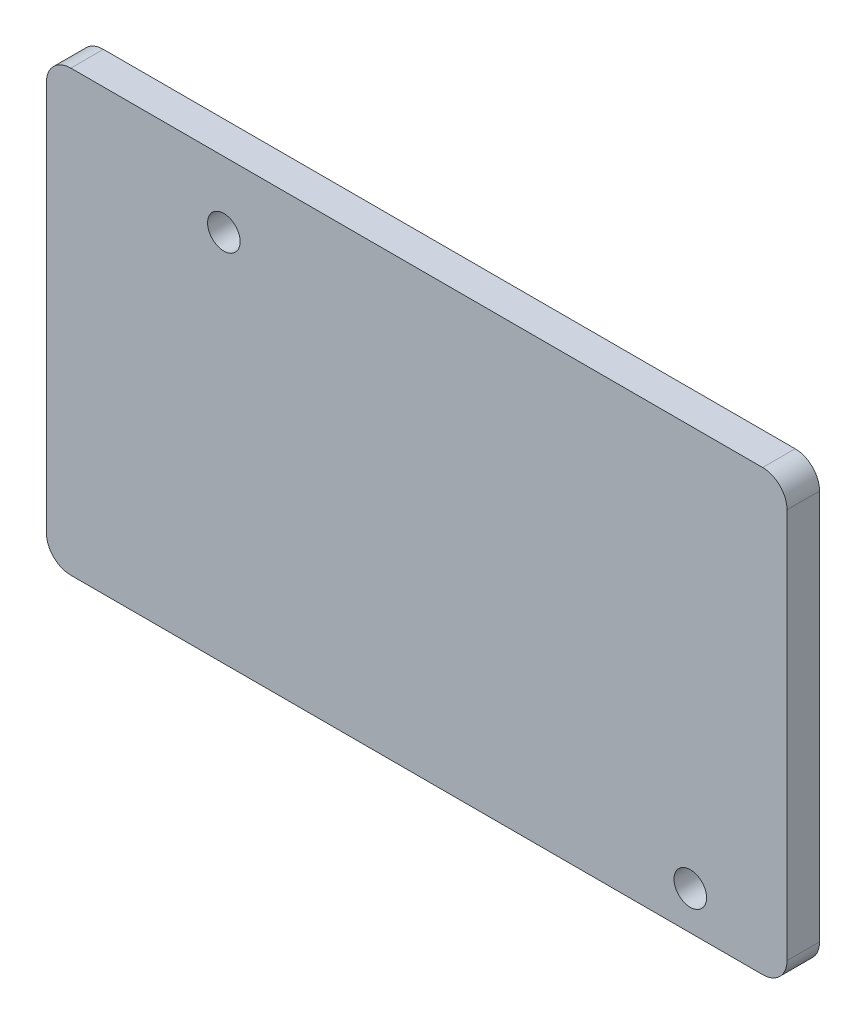
ISO-10303-21;
HEADER;
FILE_DESCRIPTION(('STEP AP214'),'2;1');
FILE_NAME('part.step','',(''),(''),'','','');
FILE_SCHEMA(('AUTOMOTIVE_DESIGN { 1 0 10303 214 1 1 1 1 }'));
ENDSEC;
DATA;
#1=APPLICATION_CONTEXT('core data for automotive mechanical design processes');
#2=APPLICATION_PROTOCOL_DEFINITION('international standard','automotive_design',2000,#1);
#3=PRODUCT_CONTEXT('',#1,'mechanical');
#4=PRODUCT('Part','Part','',(#3));
#5=PRODUCT_RELATED_PRODUCT_CATEGORY('part','',(#4));
#6=PRODUCT_DEFINITION_FORMATION('','',#4);
#7=PRODUCT_DEFINITION_CONTEXT('part definition',#1,'design');
#8=PRODUCT_DEFINITION('design','',#6,#7);
#9=PRODUCT_DEFINITION_SHAPE('','',#8);
#10=(LENGTH_UNIT() NAMED_UNIT(*) SI_UNIT(.MILLI.,.METRE.));
#11=(NAMED_UNIT(*) PLANE_ANGLE_UNIT() SI_UNIT($,.RADIAN.));
#12=(NAMED_UNIT(*) SI_UNIT($,.STERADIAN.) SOLID_ANGLE_UNIT());
#13=UNCERTAINTY_MEASURE_WITH_UNIT(LENGTH_MEASURE(1.E-05),#10,'distance_accuracy_value','');
#14=(GEOMETRIC_REPRESENTATION_CONTEXT(3) GLOBAL_UNCERTAINTY_ASSIGNED_CONTEXT((#13)) GLOBAL_UNIT_ASSIGNED_CONTEXT((#10,
#11,#12)) REPRESENTATION_CONTEXT('',''));
#15=CARTESIAN_POINT('',(0.,0.,0.));
#16=DIRECTION('',(0.,0.,1.));
#17=DIRECTION('',(1.,0.,0.));
#18=AXIS2_PLACEMENT_3D('',#15,#16,#17);
#19=CARTESIAN_POINT('',(-2.95965560785504,37.4432247837828,-2.));
#20=DIRECTION('',(0.,0.,1.));
#21=DIRECTION('',(1.,0.,0.));
#22=AXIS2_PLACEMENT_3D('',#19,#20,#21);
#23=CYLINDRICAL_SURFACE('',#22,1.5);
#24=CARTESIAN_POINT('',(-2.95965560785504,37.4432247837828,0.));
#25=DIRECTION('',(0.,0.,1.));
#26=DIRECTION('',(1.,0.,0.));
#27=AXIS2_PLACEMENT_3D('',#24,#25,#26);
#28=CIRCLE('',#27,1.5);
#29=CARTESIAN_POINT('',(-1.45965560785503,37.4432247837828,0.));
#30=VERTEX_POINT('',#29);
#31=CARTESIAN_POINT('',(-2.95965560785504,38.9432247837828,0.));
#32=VERTEX_POINT('',#31);
#33=EDGE_CURVE('E131',#30,#32,#28,.T.);
#34=ORIENTED_EDGE('',*,*,#33,.F.);
#35=DIRECTION('',(0.,0.,1.));
#36=VECTOR('',#35,1.);
#37=CARTESIAN_POINT('',(-1.45965560785503,37.4432247837828,-2.));
#38=LINE('',#37,#36);
#39=CARTESIAN_POINT('',(-1.45965560785503,37.4432247837828,-2.));
#40=VERTEX_POINT('',#39);
#41=EDGE_CURVE('E11',#40,#30,#38,.T.);
#42=ORIENTED_EDGE('',*,*,#41,.F.);
#43=CARTESIAN_POINT('',(-2.95965560785504,37.4432247837828,-2.));
#44=DIRECTION('',(0.,0.,1.));
#45=DIRECTION('',(1.,0.,0.));
#46=AXIS2_PLACEMENT_3D('',#43,#44,#45);
#47=CIRCLE('',#46,1.5);
#48=CARTESIAN_POINT('',(-2.95965560785504,38.9432247837828,-2.));
#49=VERTEX_POINT('',#48);
#50=EDGE_CURVE('E152',#40,#49,#47,.T.);
#51=ORIENTED_EDGE('',*,*,#50,.T.);
#52=DIRECTION('',(0.,0.,1.));
#53=VECTOR('',#52,1.);
#54=CARTESIAN_POINT('',(-2.95965560785504,38.9432247837828,-2.));
#55=LINE('',#54,#53);
#56=EDGE_CURVE('E37',#49,#32,#55,.T.);
#57=ORIENTED_EDGE('',*,*,#56,.T.);
#58=EDGE_LOOP('',(#34,#42,#51,#57));
#59=FACE_BOUND('',#58,.T.);
#60=ADVANCED_FACE('F34',(#59),#23,.T.);
#61=CARTESIAN_POINT('',(-1.45965560785503,13.4326394011797,-2.));
#62=DIRECTION('',(1.,0.,0.));
#63=DIRECTION('',(0.,0.,-1.));
#64=AXIS2_PLACEMENT_3D('',#61,#62,#63);
#65=PLANE('',#64);
#66=DIRECTION('',(0.,1.,0.));
#67=VECTOR('',#66,1.);
#68=CARTESIAN_POINT('',(-1.45965560785503,13.4326394011797,0.));
#69=LINE('',#68,#67);
#70=CARTESIAN_POINT('',(-1.45965560785503,13.4326394011797,0.));
#71=VERTEX_POINT('',#70);
#72=EDGE_CURVE('E150',#71,#30,#69,.T.);
#73=ORIENTED_EDGE('',*,*,#72,.F.);
#74=DIRECTION('',(0.,0.,1.));
#75=VECTOR('',#74,1.);
#76=CARTESIAN_POINT('',(-1.45965560785503,13.4326394011797,-2.));
#77=LINE('',#76,#75);
#78=CARTESIAN_POINT('',(-1.45965560785503,13.4326394011797,-2.));
#79=VERTEX_POINT('',#78);
#80=EDGE_CURVE('E43',#79,#71,#77,.T.);
#81=ORIENTED_EDGE('',*,*,#80,.F.);
#82=DIRECTION('',(0.,1.,0.));
#83=VECTOR('',#82,1.);
#84=CARTESIAN_POINT('',(-1.45965560785503,13.4326394011797,-2.));
#85=LINE('',#84,#83);
#86=EDGE_CURVE('E121',#79,#40,#85,.T.);
#87=ORIENTED_EDGE('',*,*,#86,.T.);
#88=ORIENTED_EDGE('',*,*,#41,.T.);
#89=EDGE_LOOP('',(#73,#81,#87,#88));
#90=FACE_BOUND('',#89,.T.);
#91=ADVANCED_FACE('F164',(#90),#65,.T.);
#92=CARTESIAN_POINT('',(-2.95965560785504,13.4326394011797,-2.));
#93=DIRECTION('',(0.,0.,1.));
#94=DIRECTION('',(1.,0.,0.));
#95=AXIS2_PLACEMENT_3D('',#92,#93,#94);
#96=CYLINDRICAL_SURFACE('',#95,1.5);
#97=CARTESIAN_POINT('',(-2.95965560785504,13.4326394011797,0.));
#98=DIRECTION('',(0.,0.,1.));
#99=DIRECTION('',(-1.,0.,0.));
#100=AXIS2_PLACEMENT_3D('',#97,#98,#99);
#101=CIRCLE('',#100,1.5);
#102=CARTESIAN_POINT('',(-2.95965560785504,11.9326394011797,0.));
#103=VERTEX_POINT('',#102);
#104=EDGE_CURVE('E108',#103,#71,#101,.T.);
#105=ORIENTED_EDGE('',*,*,#104,.F.);
#106=DIRECTION('',(0.,0.,1.));
#107=VECTOR('',#106,1.);
#108=CARTESIAN_POINT('',(-2.95965560785504,11.9326394011797,-2.));
#109=LINE('',#108,#107);
#110=CARTESIAN_POINT('',(-2.95965560785504,11.9326394011797,-2.));
#111=VERTEX_POINT('',#110);
#112=EDGE_CURVE('E103',#111,#103,#109,.T.);
#113=ORIENTED_EDGE('',*,*,#112,.F.);
#114=CARTESIAN_POINT('',(-2.95965560785504,13.4326394011797,-2.));
#115=DIRECTION('',(0.,0.,1.));
#116=DIRECTION('',(-1.,0.,0.));
#117=AXIS2_PLACEMENT_3D('',#114,#115,#116);
#118=CIRCLE('',#117,1.5);
#119=EDGE_CURVE('E106',#111,#79,#118,.T.);
#120=ORIENTED_EDGE('',*,*,#119,.T.);
#121=ORIENTED_EDGE('',*,*,#80,.T.);
#122=EDGE_LOOP('',(#105,#113,#120,#121));
#123=FACE_BOUND('',#122,.T.);
#124=ADVANCED_FACE('F105',(#123),#96,.T.);
#125=CARTESIAN_POINT('',(-45.5053900482001,11.9326394011797,-2.));
#126=DIRECTION('',(0.,-1.,0.));
#127=DIRECTION('',(0.,0.,-1.));
#128=AXIS2_PLACEMENT_3D('',#125,#126,#127);
#129=PLANE('',#128);
#130=DIRECTION('',(1.,0.,0.));
#131=VECTOR('',#130,1.);
#132=CARTESIAN_POINT('',(-45.5053900482001,11.9326394011797,0.));
#133=LINE('',#132,#131);
#134=CARTESIAN_POINT('',(-45.5053900482001,11.9326394011797,0.));
#135=VERTEX_POINT('',#134);
#136=EDGE_CURVE('E147',#135,#103,#133,.T.);
#137=ORIENTED_EDGE('',*,*,#136,.F.);
#138=DIRECTION('',(0.,0.,1.));
#139=VECTOR('',#138,1.);
#140=CARTESIAN_POINT('',(-45.5053900482001,11.9326394011797,-2.));
#141=LINE('',#140,#139);
#142=CARTESIAN_POINT('',(-45.5053900482001,11.9326394011797,-2.));
#143=VERTEX_POINT('',#142);
#144=EDGE_CURVE('E113',#143,#135,#141,.T.);
#145=ORIENTED_EDGE('',*,*,#144,.F.);
#146=DIRECTION('',(1.,0.,0.));
#147=VECTOR('',#146,1.);
#148=CARTESIAN_POINT('',(-45.5053900482001,11.9326394011797,-2.));
#149=LINE('',#148,#147);
#150=EDGE_CURVE('E119',#143,#111,#149,.T.);
#151=ORIENTED_EDGE('',*,*,#150,.T.);
#152=ORIENTED_EDGE('',*,*,#112,.T.);
#153=EDGE_LOOP('',(#137,#145,#151,#152));
#154=FACE_BOUND('',#153,.T.);
#155=ADVANCED_FACE('F123',(#154),#129,.T.);
#156=CARTESIAN_POINT('',(-45.5053900482001,13.4326394011797,-2.));
#157=DIRECTION('',(0.,0.,1.));
#158=DIRECTION('',(1.,0.,0.));
#159=AXIS2_PLACEMENT_3D('',#156,#157,#158);
#160=CYLINDRICAL_SURFACE('',#159,1.5);
#161=CARTESIAN_POINT('',(-45.5053900482001,13.4326394011797,0.));
#162=DIRECTION('',(0.,0.,1.));
#163=DIRECTION('',(-1.,0.,0.));
#164=AXIS2_PLACEMENT_3D('',#161,#162,#163);
#165=CIRCLE('',#164,1.5);
#166=CARTESIAN_POINT('',(-47.0053900482001,13.4326394011797,0.));
#167=VERTEX_POINT('',#166);
#168=EDGE_CURVE('E144',#167,#135,#165,.T.);
#169=ORIENTED_EDGE('',*,*,#168,.F.);
#170=DIRECTION('',(0.,0.,1.));
#171=VECTOR('',#170,1.);
#172=CARTESIAN_POINT('',(-47.0053900482001,13.4326394011797,-2.));
#173=LINE('',#172,#171);
#174=CARTESIAN_POINT('',(-47.0053900482001,13.4326394011797,-2.));
#175=VERTEX_POINT('',#174);
#176=EDGE_CURVE('E156',#175,#167,#173,.T.);
#177=ORIENTED_EDGE('',*,*,#176,.F.);
#178=CARTESIAN_POINT('',(-45.5053900482001,13.4326394011797,-2.));
#179=DIRECTION('',(0.,0.,1.));
#180=DIRECTION('',(-1.,0.,0.));
#181=AXIS2_PLACEMENT_3D('',#178,#179,#180);
#182=CIRCLE('',#181,1.5);
#183=EDGE_CURVE('E124',#175,#143,#182,.T.);
#184=ORIENTED_EDGE('',*,*,#183,.T.);
#185=ORIENTED_EDGE('',*,*,#144,.T.);
#186=EDGE_LOOP('',(#169,#177,#184,#185));
#187=FACE_BOUND('',#186,.T.);
#188=ADVANCED_FACE('F177',(#187),#160,.T.);
#189=CARTESIAN_POINT('',(-47.0053900482001,13.4326394011797,-2.));
#190=DIRECTION('',(-1.,0.,0.));
#191=DIRECTION('',(0.,0.,1.));
#192=AXIS2_PLACEMENT_3D('',#189,#190,#191);
#193=PLANE('',#192);
#194=DIRECTION('',(0.,-1.,0.));
#195=VECTOR('',#194,1.);
#196=CARTESIAN_POINT('',(-47.0053900482001,13.4326394011797,0.));
#197=LINE('',#196,#195);
#198=CARTESIAN_POINT('',(-47.0053900482001,37.4432247837828,0.));
#199=VERTEX_POINT('',#198);
#200=EDGE_CURVE('E141',#199,#167,#197,.T.);
#201=ORIENTED_EDGE('',*,*,#200,.F.);
#202=DIRECTION('',(0.,0.,1.));
#203=VECTOR('',#202,1.);
#204=CARTESIAN_POINT('',(-47.0053900482001,37.4432247837828,-2.));
#205=LINE('',#204,#203);
#206=CARTESIAN_POINT('',(-47.0053900482001,37.4432247837828,-2.));
#207=VERTEX_POINT('',#206);
#208=EDGE_CURVE('E158',#207,#199,#205,.T.);
#209=ORIENTED_EDGE('',*,*,#208,.F.);
#210=DIRECTION('',(0.,-1.,0.));
#211=VECTOR('',#210,1.);
#212=CARTESIAN_POINT('',(-47.0053900482001,13.4326394011797,-2.));
#213=LINE('',#212,#211);
#214=EDGE_CURVE('E126',#207,#175,#213,.T.);
#215=ORIENTED_EDGE('',*,*,#214,.T.);
#216=ORIENTED_EDGE('',*,*,#176,.T.);
#217=EDGE_LOOP('',(#201,#209,#215,#216));
#218=FACE_BOUND('',#217,.T.);
#219=ADVANCED_FACE('F180',(#218),#193,.T.);
#220=CARTESIAN_POINT('',(-45.5053900482001,37.4432247837828,-2.));
#221=DIRECTION('',(0.,0.,1.));
#222=DIRECTION('',(1.,0.,0.));
#223=AXIS2_PLACEMENT_3D('',#220,#221,#222);
#224=CYLINDRICAL_SURFACE('',#223,1.5);
#225=CARTESIAN_POINT('',(-45.5053900482001,37.4432247837828,0.));
#226=DIRECTION('',(0.,0.,1.));
#227=DIRECTION('',(-1.,0.,0.));
#228=AXIS2_PLACEMENT_3D('',#225,#226,#227);
#229=CIRCLE('',#228,1.5);
#230=CARTESIAN_POINT('',(-45.5053900482001,38.9432247837828,0.));
#231=VERTEX_POINT('',#230);
#232=EDGE_CURVE('E138',#231,#199,#229,.T.);
#233=ORIENTED_EDGE('',*,*,#232,.F.);
#234=DIRECTION('',(0.,0.,1.));
#235=VECTOR('',#234,1.);
#236=CARTESIAN_POINT('',(-45.5053900482001,38.9432247837828,-2.));
#237=LINE('',#236,#235);
#238=CARTESIAN_POINT('',(-45.5053900482001,38.9432247837828,-2.));
#239=VERTEX_POINT('',#238);
#240=EDGE_CURVE('E159',#239,#231,#237,.T.);
#241=ORIENTED_EDGE('',*,*,#240,.F.);
#242=CARTESIAN_POINT('',(-45.5053900482001,37.4432247837828,-2.));
#243=DIRECTION('',(0.,0.,1.));
#244=DIRECTION('',(-1.,0.,0.));
#245=AXIS2_PLACEMENT_3D('',#242,#243,#244);
#246=CIRCLE('',#245,1.5);
#247=EDGE_CURVE('E226',#239,#207,#246,.T.);
#248=ORIENTED_EDGE('',*,*,#247,.T.);
#249=ORIENTED_EDGE('',*,*,#208,.T.);
#250=EDGE_LOOP('',(#233,#241,#248,#249));
#251=FACE_BOUND('',#250,.T.);
#252=ADVANCED_FACE('F184',(#251),#224,.T.);
#253=CARTESIAN_POINT('',(-45.5053900482001,38.9432247837828,-2.));
#254=DIRECTION('',(0.,1.,0.));
#255=DIRECTION('',(0.,0.,1.));
#256=AXIS2_PLACEMENT_3D('',#253,#254,#255);
#257=PLANE('',#256);
#258=DIRECTION('',(-1.,0.,0.));
#259=VECTOR('',#258,1.);
#260=CARTESIAN_POINT('',(-45.5053900482001,38.9432247837828,0.));
#261=LINE('',#260,#259);
#262=EDGE_CURVE('E134',#32,#231,#261,.T.);
#263=ORIENTED_EDGE('',*,*,#262,.F.);
#264=ORIENTED_EDGE('',*,*,#56,.F.);
#265=DIRECTION('',(-1.,0.,0.));
#266=VECTOR('',#265,1.);
#267=CARTESIAN_POINT('',(-45.5053900482001,38.9432247837828,-2.));
#268=LINE('',#267,#266);
#269=EDGE_CURVE('E224',#49,#239,#268,.T.);
#270=ORIENTED_EDGE('',*,*,#269,.T.);
#271=ORIENTED_EDGE('',*,*,#240,.T.);
#272=EDGE_LOOP('',(#263,#264,#270,#271));
#273=FACE_BOUND('',#272,.T.);
#274=ADVANCED_FACE('F161',(#273),#257,.T.);
#275=CARTESIAN_POINT('',(-2.95965560785504,37.4432247837828,-2.));
#276=DIRECTION('',(0.,0.,1.));
#277=DIRECTION('',(1.,0.,0.));
#278=AXIS2_PLACEMENT_3D('',#275,#276,#277);
#279=PLANE('',#278);
#280=CARTESIAN_POINT('',(-36.0943318790436,34.9052346011537,-2.));
#281=DIRECTION('',(0.,0.,1.));
#282=DIRECTION('',(1.,0.,0.));
#283=AXIS2_PLACEMENT_3D('',#280,#281,#282);
#284=CIRCLE('',#283,1.00217557349742);
#285=CARTESIAN_POINT('',(-35.0921563055461,34.9052346011537,-2.));
#286=VERTEX_POINT('',#285);
#287=EDGE_CURVE('E211',#286,#286,#284,.T.);
#288=ORIENTED_EDGE('',*,*,#287,.T.);
#289=EDGE_LOOP('',(#288));
#290=FACE_BOUND('',#289,.T.);
#291=CARTESIAN_POINT('',(-7.41023704801487,14.2984126674966,-2.));
#292=DIRECTION('',(0.,0.,1.));
#293=DIRECTION('',(1.,0.,0.));
#294=AXIS2_PLACEMENT_3D('',#291,#292,#293);
#295=CIRCLE('',#294,1.00217557349742);
#296=CARTESIAN_POINT('',(-6.40806147451745,14.2984126674966,-2.));
#297=VERTEX_POINT('',#296);
#298=EDGE_CURVE('E135',#297,#297,#295,.T.);
#299=ORIENTED_EDGE('',*,*,#298,.T.);
#300=EDGE_LOOP('',(#299));
#301=FACE_BOUND('',#300,.T.);
#302=ORIENTED_EDGE('',*,*,#50,.F.);
#303=ORIENTED_EDGE('',*,*,#86,.F.);
#304=ORIENTED_EDGE('',*,*,#119,.F.);
#305=ORIENTED_EDGE('',*,*,#150,.F.);
#306=ORIENTED_EDGE('',*,*,#183,.F.);
#307=ORIENTED_EDGE('',*,*,#214,.F.);
#308=ORIENTED_EDGE('',*,*,#247,.F.);
#309=ORIENTED_EDGE('',*,*,#269,.F.);
#310=EDGE_LOOP('',(#302,#303,#304,#305,#306,#307,#308,#309));
#311=FACE_BOUND('',#310,.T.);
#312=ADVANCED_FACE('F117',(#290,#301,#311),#279,.F.);
#313=CARTESIAN_POINT('',(-2.95965560785504,37.4432247837828,0.));
#314=DIRECTION('',(0.,0.,1.));
#315=DIRECTION('',(1.,0.,0.));
#316=AXIS2_PLACEMENT_3D('',#313,#314,#315);
#317=PLANE('',#316);
#318=CARTESIAN_POINT('',(-36.0943318790436,34.9052346011537,0.));
#319=DIRECTION('',(0.,0.,1.));
#320=DIRECTION('',(1.,0.,0.));
#321=AXIS2_PLACEMENT_3D('',#318,#319,#320);
#322=CIRCLE('',#321,1.00217557349742);
#323=CARTESIAN_POINT('',(-35.0921563055461,34.9052346011537,0.));
#324=VERTEX_POINT('',#323);
#325=EDGE_CURVE('E214',#324,#324,#322,.T.);
#326=ORIENTED_EDGE('',*,*,#325,.F.);
#327=EDGE_LOOP('',(#326));
#328=FACE_BOUND('',#327,.T.);
#329=CARTESIAN_POINT('',(-7.41023704801487,14.2984126674966,0.));
#330=DIRECTION('',(0.,0.,1.));
#331=DIRECTION('',(1.,0.,0.));
#332=AXIS2_PLACEMENT_3D('',#329,#330,#331);
#333=CIRCLE('',#332,1.00217557349742);
#334=CARTESIAN_POINT('',(-6.40806147451745,14.2984126674966,0.));
#335=VERTEX_POINT('',#334);
#336=EDGE_CURVE('E216',#335,#335,#333,.T.);
#337=ORIENTED_EDGE('',*,*,#336,.F.);
#338=EDGE_LOOP('',(#337));
#339=FACE_BOUND('',#338,.T.);
#340=ORIENTED_EDGE('',*,*,#33,.T.);
#341=ORIENTED_EDGE('',*,*,#262,.T.);
#342=ORIENTED_EDGE('',*,*,#232,.T.);
#343=ORIENTED_EDGE('',*,*,#200,.T.);
#344=ORIENTED_EDGE('',*,*,#168,.T.);
#345=ORIENTED_EDGE('',*,*,#136,.T.);
#346=ORIENTED_EDGE('',*,*,#104,.T.);
#347=ORIENTED_EDGE('',*,*,#72,.T.);
#348=EDGE_LOOP('',(#340,#341,#342,#343,#344,#345,#346,#347));
#349=FACE_BOUND('',#348,.T.);
#350=ADVANCED_FACE('F163',(#328,#339,#349),#317,.T.);
#351=CARTESIAN_POINT('',(-7.41023704801487,14.2984126674966,-2.));
#352=DIRECTION('',(0.,0.,1.));
#353=DIRECTION('',(1.,0.,0.));
#354=AXIS2_PLACEMENT_3D('',#351,#352,#353);
#355=CYLINDRICAL_SURFACE('',#354,1.00217557349742);
#356=ORIENTED_EDGE('',*,*,#298,.F.);
#357=EDGE_LOOP('',(#356));
#358=FACE_BOUND('',#357,.T.);
#359=ORIENTED_EDGE('',*,*,#336,.T.);
#360=EDGE_LOOP('',(#359));
#361=FACE_BOUND('',#360,.T.);
#362=ADVANCED_FACE('F196',(#358,#361),#355,.F.);
#363=CARTESIAN_POINT('',(-36.0943318790436,34.9052346011537,-2.));
#364=DIRECTION('',(0.,0.,1.));
#365=DIRECTION('',(1.,0.,0.));
#366=AXIS2_PLACEMENT_3D('',#363,#364,#365);
#367=CYLINDRICAL_SURFACE('',#366,1.00217557349742);
#368=ORIENTED_EDGE('',*,*,#287,.F.);
#369=EDGE_LOOP('',(#368));
#370=FACE_BOUND('',#369,.T.);
#371=ORIENTED_EDGE('',*,*,#325,.T.);
#372=EDGE_LOOP('',(#371));
#373=FACE_BOUND('',#372,.T.);
#374=ADVANCED_FACE('F203',(#370,#373),#367,.F.);
#375=CLOSED_SHELL('',(#60,#91,#124,#155,#188,#219,#252,#274,#312,#350,#362,#374));
#376=MANIFOLD_SOLID_BREP('B2',#375);
#377=ADVANCED_BREP_SHAPE_REPRESENTATION('',(#18,#376),#14);
#378=SHAPE_DEFINITION_REPRESENTATION(#9,#377);
ENDSEC;
END-ISO-10303-21;
